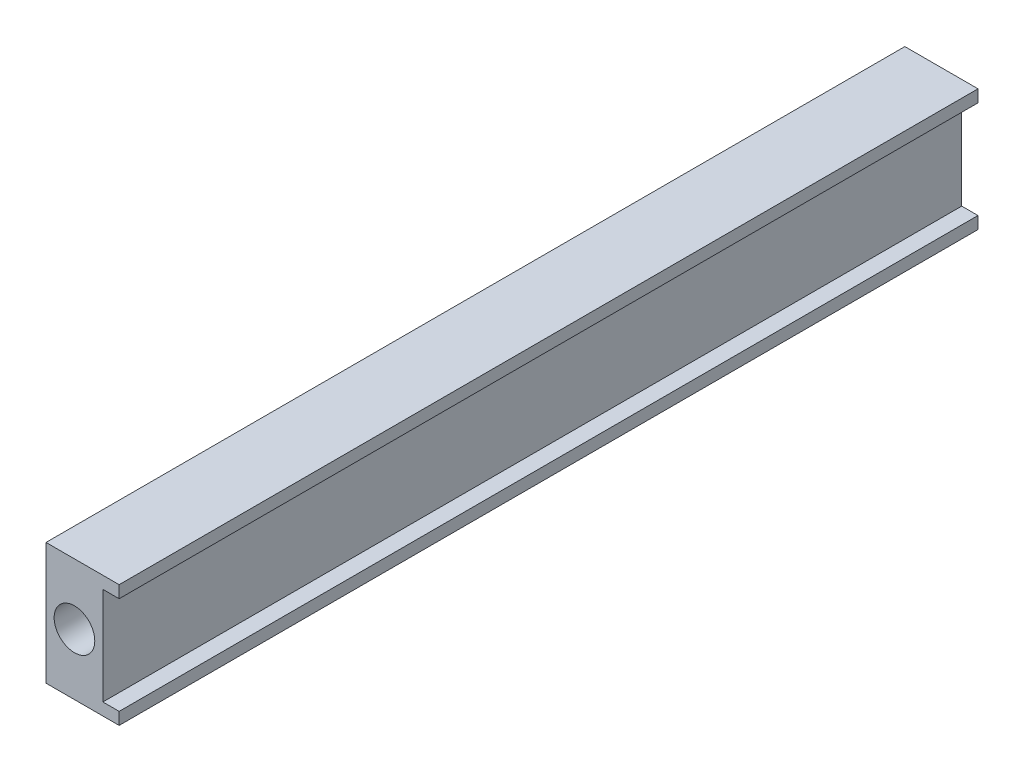
ISO-10303-21;
HEADER;
FILE_DESCRIPTION(('STEP AP214'),'2;1');
FILE_NAME('part.step','',(''),(''),'','','');
FILE_SCHEMA(('AUTOMOTIVE_DESIGN { 1 0 10303 214 1 1 1 1 }'));
ENDSEC;
DATA;
#1=APPLICATION_CONTEXT('core data for automotive mechanical design processes');
#2=APPLICATION_PROTOCOL_DEFINITION('international standard','automotive_design',2000,#1);
#3=PRODUCT_CONTEXT('',#1,'mechanical');
#4=PRODUCT('Part','Part','',(#3));
#5=PRODUCT_RELATED_PRODUCT_CATEGORY('part','',(#4));
#6=PRODUCT_DEFINITION_FORMATION('','',#4);
#7=PRODUCT_DEFINITION_CONTEXT('part definition',#1,'design');
#8=PRODUCT_DEFINITION('design','',#6,#7);
#9=PRODUCT_DEFINITION_SHAPE('','',#8);
#10=(LENGTH_UNIT() NAMED_UNIT(*) SI_UNIT(.MILLI.,.METRE.));
#11=(NAMED_UNIT(*) PLANE_ANGLE_UNIT() SI_UNIT($,.RADIAN.));
#12=(NAMED_UNIT(*) SI_UNIT($,.STERADIAN.) SOLID_ANGLE_UNIT());
#13=UNCERTAINTY_MEASURE_WITH_UNIT(LENGTH_MEASURE(1.E-05),#10,'distance_accuracy_value','');
#14=(GEOMETRIC_REPRESENTATION_CONTEXT(3) GLOBAL_UNCERTAINTY_ASSIGNED_CONTEXT((#13)) GLOBAL_UNIT_ASSIGNED_CONTEXT((#10,
#11,#12)) REPRESENTATION_CONTEXT('',''));
#15=CARTESIAN_POINT('',(0.,0.,0.));
#16=DIRECTION('',(0.,0.,1.));
#17=DIRECTION('',(1.,0.,0.));
#18=AXIS2_PLACEMENT_3D('',#15,#16,#17);
#19=CARTESIAN_POINT('',(18.,0.,-211.341));
#20=DIRECTION('',(1.,0.,0.));
#21=DIRECTION('',(0.,1.,0.));
#22=AXIS2_PLACEMENT_3D('',#19,#20,#21);
#23=PLANE('',#22);
#24=DIRECTION('',(0.,0.,1.));
#25=VECTOR('',#24,1.);
#26=CARTESIAN_POINT('',(18.,-27.,-1000.));
#27=LINE('',#26,#25);
#28=CARTESIAN_POINT('',(18.,-27.,-211.341));
#29=VERTEX_POINT('',#28);
#30=CARTESIAN_POINT('',(18.,-27.,0.));
#31=VERTEX_POINT('',#30);
#32=EDGE_CURVE('E139',#29,#31,#27,.T.);
#33=ORIENTED_EDGE('',*,*,#32,.T.);
#34=DIRECTION('',(0.,1.,0.));
#35=VECTOR('',#34,1.);
#36=CARTESIAN_POINT('',(18.,0.,0.));
#37=LINE('',#36,#35);
#38=CARTESIAN_POINT('',(18.,-30.,0.));
#39=VERTEX_POINT('',#38);
#40=EDGE_CURVE('E168',#39,#31,#37,.T.);
#41=ORIENTED_EDGE('',*,*,#40,.F.);
#42=DIRECTION('',(0.,0.,1.));
#43=VECTOR('',#42,1.);
#44=CARTESIAN_POINT('',(18.,-30.,-211.341));
#45=LINE('',#44,#43);
#46=CARTESIAN_POINT('',(18.,-30.,-211.341));
#47=VERTEX_POINT('',#46);
#48=EDGE_CURVE('E173',#47,#39,#45,.T.);
#49=ORIENTED_EDGE('',*,*,#48,.F.);
#50=DIRECTION('',(0.,1.,0.));
#51=VECTOR('',#50,1.);
#52=CARTESIAN_POINT('',(18.,0.,-211.341));
#53=LINE('',#52,#51);
#54=EDGE_CURVE('E157',#47,#29,#53,.T.);
#55=ORIENTED_EDGE('',*,*,#54,.T.);
#56=EDGE_LOOP('',(#33,#41,#49,#55));
#57=FACE_BOUND('',#56,.T.);
#58=ADVANCED_FACE('F41',(#57),#23,.T.);
#59=CARTESIAN_POINT('',(0.,0.,-211.341));
#60=DIRECTION('',(-1.,0.,0.));
#61=DIRECTION('',(0.,0.,1.));
#62=AXIS2_PLACEMENT_3D('',#59,#60,#61);
#63=PLANE('',#62);
#64=DIRECTION('',(0.,-1.,0.));
#65=VECTOR('',#64,1.);
#66=CARTESIAN_POINT('',(0.,0.,0.));
#67=LINE('',#66,#65);
#68=CARTESIAN_POINT('',(0.,0.,0.));
#69=VERTEX_POINT('',#68);
#70=CARTESIAN_POINT('',(0.,-30.,0.));
#71=VERTEX_POINT('',#70);
#72=EDGE_CURVE('E150',#69,#71,#67,.T.);
#73=ORIENTED_EDGE('',*,*,#72,.F.);
#74=DIRECTION('',(0.,0.,1.));
#75=VECTOR('',#74,1.);
#76=CARTESIAN_POINT('',(0.,0.,-211.341));
#77=LINE('',#76,#75);
#78=CARTESIAN_POINT('',(0.,0.,-211.341));
#79=VERTEX_POINT('',#78);
#80=EDGE_CURVE('E11',#79,#69,#77,.T.);
#81=ORIENTED_EDGE('',*,*,#80,.F.);
#82=DIRECTION('',(0.,-1.,0.));
#83=VECTOR('',#82,1.);
#84=CARTESIAN_POINT('',(0.,0.,-211.341));
#85=LINE('',#84,#83);
#86=CARTESIAN_POINT('',(0.,-30.,-211.341));
#87=VERTEX_POINT('',#86);
#88=EDGE_CURVE('E151',#79,#87,#85,.T.);
#89=ORIENTED_EDGE('',*,*,#88,.T.);
#90=DIRECTION('',(0.,0.,1.));
#91=VECTOR('',#90,1.);
#92=CARTESIAN_POINT('',(0.,-30.,-211.341));
#93=LINE('',#92,#91);
#94=EDGE_CURVE('E45',#87,#71,#93,.T.);
#95=ORIENTED_EDGE('',*,*,#94,.T.);
#96=EDGE_LOOP('',(#73,#81,#89,#95));
#97=FACE_BOUND('',#96,.T.);
#98=ADVANCED_FACE('F43',(#97),#63,.T.);
#99=CARTESIAN_POINT('',(0.,0.,-211.341));
#100=DIRECTION('',(0.,1.,0.));
#101=DIRECTION('',(0.,0.,1.));
#102=AXIS2_PLACEMENT_3D('',#99,#100,#101);
#103=PLANE('',#102);
#104=DIRECTION('',(-1.,0.,0.));
#105=VECTOR('',#104,1.);
#106=CARTESIAN_POINT('',(0.,0.,0.));
#107=LINE('',#106,#105);
#108=CARTESIAN_POINT('',(18.,0.,0.));
#109=VERTEX_POINT('',#108);
#110=EDGE_CURVE('E154',#109,#69,#107,.T.);
#111=ORIENTED_EDGE('',*,*,#110,.F.);
#112=DIRECTION('',(0.,0.,1.));
#113=VECTOR('',#112,1.);
#114=CARTESIAN_POINT('',(18.,0.,-211.341));
#115=LINE('',#114,#113);
#116=CARTESIAN_POINT('',(18.,0.,-211.341));
#117=VERTEX_POINT('',#116);
#118=EDGE_CURVE('E50',#117,#109,#115,.T.);
#119=ORIENTED_EDGE('',*,*,#118,.F.);
#120=DIRECTION('',(-1.,0.,0.));
#121=VECTOR('',#120,1.);
#122=CARTESIAN_POINT('',(0.,0.,-211.341));
#123=LINE('',#122,#121);
#124=EDGE_CURVE('E160',#117,#79,#123,.T.);
#125=ORIENTED_EDGE('',*,*,#124,.T.);
#126=ORIENTED_EDGE('',*,*,#80,.T.);
#127=EDGE_LOOP('',(#111,#119,#125,#126));
#128=FACE_BOUND('',#127,.T.);
#129=ADVANCED_FACE('F177',(#128),#103,.T.);
#130=DIRECTION('',(0.,0.,1.));
#131=VECTOR('',#130,1.);
#132=CARTESIAN_POINT('',(18.,-3.,-1000.));
#133=LINE('',#132,#131);
#134=CARTESIAN_POINT('',(18.,-3.,-211.341));
#135=VERTEX_POINT('',#134);
#136=CARTESIAN_POINT('',(18.,-3.,0.));
#137=VERTEX_POINT('',#136);
#138=EDGE_CURVE('E58',#135,#137,#133,.T.);
#139=ORIENTED_EDGE('',*,*,#138,.F.);
#140=EDGE_CURVE('E156',#135,#117,#53,.T.);
#141=ORIENTED_EDGE('',*,*,#140,.T.);
#142=ORIENTED_EDGE('',*,*,#118,.T.);
#143=EDGE_CURVE('E167',#137,#109,#37,.T.);
#144=ORIENTED_EDGE('',*,*,#143,.F.);
#145=EDGE_LOOP('',(#139,#141,#142,#144));
#146=FACE_BOUND('',#145,.T.);
#147=ADVANCED_FACE('F187',(#146),#23,.T.);
#148=CARTESIAN_POINT('',(0.,-30.,-211.341));
#149=DIRECTION('',(0.,-1.,0.));
#150=DIRECTION('',(0.,0.,-1.));
#151=AXIS2_PLACEMENT_3D('',#148,#149,#150);
#152=PLANE('',#151);
#153=DIRECTION('',(1.,0.,0.));
#154=VECTOR('',#153,1.);
#155=CARTESIAN_POINT('',(0.,-30.,0.));
#156=LINE('',#155,#154);
#157=EDGE_CURVE('E164',#71,#39,#156,.T.);
#158=ORIENTED_EDGE('',*,*,#157,.F.);
#159=ORIENTED_EDGE('',*,*,#94,.F.);
#160=DIRECTION('',(1.,0.,0.));
#161=VECTOR('',#160,1.);
#162=CARTESIAN_POINT('',(0.,-30.,-211.341));
#163=LINE('',#162,#161);
#164=EDGE_CURVE('E153',#87,#47,#163,.T.);
#165=ORIENTED_EDGE('',*,*,#164,.T.);
#166=ORIENTED_EDGE('',*,*,#48,.T.);
#167=EDGE_LOOP('',(#158,#159,#165,#166));
#168=FACE_BOUND('',#167,.T.);
#169=ADVANCED_FACE('F175',(#168),#152,.T.);
#170=CARTESIAN_POINT('',(0.,0.,-211.341));
#171=DIRECTION('',(0.,0.,1.));
#172=DIRECTION('',(1.,0.,0.));
#173=AXIS2_PLACEMENT_3D('',#170,#171,#172);
#174=PLANE('',#173);
#175=CARTESIAN_POINT('',(7.,-15.,-211.341));
#176=DIRECTION('',(0.,0.,-1.));
#177=DIRECTION('',(-1.,0.,0.));
#178=AXIS2_PLACEMENT_3D('',#175,#176,#177);
#179=CIRCLE('',#178,5.);
#180=CARTESIAN_POINT('',(2.,-15.,-211.341));
#181=VERTEX_POINT('',#180);
#182=EDGE_CURVE('E328',#181,#181,#179,.T.);
#183=ORIENTED_EDGE('',*,*,#182,.F.);
#184=EDGE_LOOP('',(#183));
#185=FACE_BOUND('',#184,.T.);
#186=DIRECTION('',(0.,-1.,0.));
#187=VECTOR('',#186,1.);
#188=CARTESIAN_POINT('',(14.,0.,-211.341));
#189=LINE('',#188,#187);
#190=CARTESIAN_POINT('',(14.,-3.,-211.341));
#191=VERTEX_POINT('',#190);
#192=CARTESIAN_POINT('',(14.,-27.,-211.341));
#193=VERTEX_POINT('',#192);
#194=EDGE_CURVE('E122',#191,#193,#189,.T.);
#195=ORIENTED_EDGE('',*,*,#194,.T.);
#196=DIRECTION('',(1.,0.,0.));
#197=VECTOR('',#196,1.);
#198=CARTESIAN_POINT('',(0.,-27.,-211.341));
#199=LINE('',#198,#197);
#200=EDGE_CURVE('E147',#193,#29,#199,.T.);
#201=ORIENTED_EDGE('',*,*,#200,.T.);
#202=ORIENTED_EDGE('',*,*,#54,.F.);
#203=ORIENTED_EDGE('',*,*,#164,.F.);
#204=ORIENTED_EDGE('',*,*,#88,.F.);
#205=ORIENTED_EDGE('',*,*,#124,.F.);
#206=ORIENTED_EDGE('',*,*,#140,.F.);
#207=DIRECTION('',(-1.,0.,0.));
#208=VECTOR('',#207,1.);
#209=CARTESIAN_POINT('',(0.,-3.,-211.341));
#210=LINE('',#209,#208);
#211=EDGE_CURVE('E142',#135,#191,#210,.T.);
#212=ORIENTED_EDGE('',*,*,#211,.T.);
#213=EDGE_LOOP('',(#195,#201,#202,#203,#204,#205,#206,#212));
#214=FACE_BOUND('',#213,.T.);
#215=ADVANCED_FACE('F182',(#185,#214),#174,.F.);
#216=CARTESIAN_POINT('',(0.,0.,0.));
#217=DIRECTION('',(0.,0.,1.));
#218=DIRECTION('',(1.,0.,0.));
#219=AXIS2_PLACEMENT_3D('',#216,#217,#218);
#220=PLANE('',#219);
#221=CARTESIAN_POINT('',(7.,-15.,0.));
#222=DIRECTION('',(0.,0.,1.));
#223=DIRECTION('',(1.,0.,0.));
#224=AXIS2_PLACEMENT_3D('',#221,#222,#223);
#225=CIRCLE('',#224,5.);
#226=CARTESIAN_POINT('',(12.,-15.,0.));
#227=VERTEX_POINT('',#226);
#228=EDGE_CURVE('E327',#227,#227,#225,.T.);
#229=ORIENTED_EDGE('',*,*,#228,.F.);
#230=EDGE_LOOP('',(#229));
#231=FACE_BOUND('',#230,.T.);
#232=DIRECTION('',(1.,0.,0.));
#233=VECTOR('',#232,1.);
#234=CARTESIAN_POINT('',(18.,-27.,0.));
#235=LINE('',#234,#233);
#236=CARTESIAN_POINT('',(14.,-27.,0.));
#237=VERTEX_POINT('',#236);
#238=EDGE_CURVE('E134',#237,#31,#235,.T.);
#239=ORIENTED_EDGE('',*,*,#238,.F.);
#240=DIRECTION('',(0.,-1.,0.));
#241=VECTOR('',#240,1.);
#242=CARTESIAN_POINT('',(14.,-3.,0.));
#243=LINE('',#242,#241);
#244=CARTESIAN_POINT('',(14.,-3.,0.));
#245=VERTEX_POINT('',#244);
#246=EDGE_CURVE('E119',#245,#237,#243,.T.);
#247=ORIENTED_EDGE('',*,*,#246,.F.);
#248=DIRECTION('',(-1.,0.,0.));
#249=VECTOR('',#248,1.);
#250=CARTESIAN_POINT('',(18.,-3.,0.));
#251=LINE('',#250,#249);
#252=EDGE_CURVE('E126',#137,#245,#251,.T.);
#253=ORIENTED_EDGE('',*,*,#252,.F.);
#254=ORIENTED_EDGE('',*,*,#143,.T.);
#255=ORIENTED_EDGE('',*,*,#110,.T.);
#256=ORIENTED_EDGE('',*,*,#72,.T.);
#257=ORIENTED_EDGE('',*,*,#157,.T.);
#258=ORIENTED_EDGE('',*,*,#40,.T.);
#259=EDGE_LOOP('',(#239,#247,#253,#254,#255,#256,#257,#258));
#260=FACE_BOUND('',#259,.T.);
#261=ADVANCED_FACE('F132',(#231,#260),#220,.T.);
#262=CARTESIAN_POINT('',(18.,-27.,-1000.));
#263=DIRECTION('',(0.,-1.,0.));
#264=DIRECTION('',(0.,0.,-1.));
#265=AXIS2_PLACEMENT_3D('',#262,#263,#264);
#266=PLANE('',#265);
#267=DIRECTION('',(0.,0.,1.));
#268=VECTOR('',#267,1.);
#269=CARTESIAN_POINT('',(14.,-27.,-1000.));
#270=LINE('',#269,#268);
#271=EDGE_CURVE('E124',#193,#237,#270,.T.);
#272=ORIENTED_EDGE('',*,*,#271,.T.);
#273=ORIENTED_EDGE('',*,*,#238,.T.);
#274=ORIENTED_EDGE('',*,*,#32,.F.);
#275=ORIENTED_EDGE('',*,*,#200,.F.);
#276=EDGE_LOOP('',(#272,#273,#274,#275));
#277=FACE_BOUND('',#276,.T.);
#278=ADVANCED_FACE('F186',(#277),#266,.F.);
#279=CARTESIAN_POINT('',(14.,-3.,-1000.));
#280=DIRECTION('',(-1.,0.,0.));
#281=DIRECTION('',(0.,-1.,0.));
#282=AXIS2_PLACEMENT_3D('',#279,#280,#281);
#283=PLANE('',#282);
#284=DIRECTION('',(0.,0.,1.));
#285=VECTOR('',#284,1.);
#286=CARTESIAN_POINT('',(14.,-3.,-1000.));
#287=LINE('',#286,#285);
#288=EDGE_CURVE('E115',#191,#245,#287,.T.);
#289=ORIENTED_EDGE('',*,*,#288,.T.);
#290=ORIENTED_EDGE('',*,*,#246,.T.);
#291=ORIENTED_EDGE('',*,*,#271,.F.);
#292=ORIENTED_EDGE('',*,*,#194,.F.);
#293=EDGE_LOOP('',(#289,#290,#291,#292));
#294=FACE_BOUND('',#293,.T.);
#295=ADVANCED_FACE('F116',(#294),#283,.F.);
#296=CARTESIAN_POINT('',(18.,-3.,-1000.));
#297=DIRECTION('',(0.,1.,0.));
#298=DIRECTION('',(-1.,0.,0.));
#299=AXIS2_PLACEMENT_3D('',#296,#297,#298);
#300=PLANE('',#299);
#301=ORIENTED_EDGE('',*,*,#138,.T.);
#302=ORIENTED_EDGE('',*,*,#252,.T.);
#303=ORIENTED_EDGE('',*,*,#288,.F.);
#304=ORIENTED_EDGE('',*,*,#211,.F.);
#305=EDGE_LOOP('',(#301,#302,#303,#304));
#306=FACE_BOUND('',#305,.T.);
#307=ADVANCED_FACE('F127',(#306),#300,.F.);
#308=CARTESIAN_POINT('',(7.,-15.,-25.));
#309=DIRECTION('',(0.,0.,1.));
#310=DIRECTION('',(1.,0.,0.));
#311=AXIS2_PLACEMENT_3D('',#308,#309,#310);
#312=CYLINDRICAL_SURFACE('',#311,5.);
#313=CARTESIAN_POINT('',(7.,-15.,-25.));
#314=DIRECTION('',(0.,0.,1.));
#315=DIRECTION('',(1.,0.,0.));
#316=AXIS2_PLACEMENT_3D('',#313,#314,#315);
#317=CIRCLE('',#316,5.);
#318=CARTESIAN_POINT('',(12.,-15.,-25.));
#319=VERTEX_POINT('',#318);
#320=EDGE_CURVE('E130',#319,#319,#317,.T.);
#321=ORIENTED_EDGE('',*,*,#320,.F.);
#322=EDGE_LOOP('',(#321));
#323=FACE_BOUND('',#322,.T.);
#324=ORIENTED_EDGE('',*,*,#228,.T.);
#325=EDGE_LOOP('',(#324));
#326=FACE_BOUND('',#325,.T.);
#327=ADVANCED_FACE('F253',(#323,#326),#312,.F.);
#328=CARTESIAN_POINT('',(7.,-15.,-25.));
#329=DIRECTION('',(0.,0.,1.));
#330=DIRECTION('',(1.,0.,0.));
#331=AXIS2_PLACEMENT_3D('',#328,#329,#330);
#332=PLANE('',#331);
#333=ORIENTED_EDGE('',*,*,#320,.T.);
#334=EDGE_LOOP('',(#333));
#335=FACE_BOUND('',#334,.T.);
#336=ADVANCED_FACE('F271',(#335),#332,.T.);
#337=CARTESIAN_POINT('',(7.,-15.,-186.341));
#338=DIRECTION('',(0.,0.,-1.));
#339=DIRECTION('',(-1.,0.,0.));
#340=AXIS2_PLACEMENT_3D('',#337,#338,#339);
#341=CYLINDRICAL_SURFACE('',#340,5.);
#342=CARTESIAN_POINT('',(7.,-15.,-186.341));
#343=DIRECTION('',(0.,0.,-1.));
#344=DIRECTION('',(-1.,0.,0.));
#345=AXIS2_PLACEMENT_3D('',#342,#343,#344);
#346=CIRCLE('',#345,5.);
#347=CARTESIAN_POINT('',(2.,-15.,-186.341));
#348=VERTEX_POINT('',#347);
#349=EDGE_CURVE('E326',#348,#348,#346,.T.);
#350=ORIENTED_EDGE('',*,*,#349,.F.);
#351=EDGE_LOOP('',(#350));
#352=FACE_BOUND('',#351,.T.);
#353=ORIENTED_EDGE('',*,*,#182,.T.);
#354=EDGE_LOOP('',(#353));
#355=FACE_BOUND('',#354,.T.);
#356=ADVANCED_FACE('F282',(#352,#355),#341,.F.);
#357=CARTESIAN_POINT('',(7.,-15.,-186.341));
#358=DIRECTION('',(0.,0.,-1.));
#359=DIRECTION('',(-1.,0.,0.));
#360=AXIS2_PLACEMENT_3D('',#357,#358,#359);
#361=PLANE('',#360);
#362=ORIENTED_EDGE('',*,*,#349,.T.);
#363=EDGE_LOOP('',(#362));
#364=FACE_BOUND('',#363,.T.);
#365=ADVANCED_FACE('F301',(#364),#361,.T.);
#366=CLOSED_SHELL('',(#58,#98,#129,#147,#169,#215,#261,#278,#295,#307,#327,#336,#356,#365));
#367=MANIFOLD_SOLID_BREP('B2',#366);
#368=ADVANCED_BREP_SHAPE_REPRESENTATION('',(#18,#367),#14);
#369=SHAPE_DEFINITION_REPRESENTATION(#9,#368);
ENDSEC;
END-ISO-10303-21;
